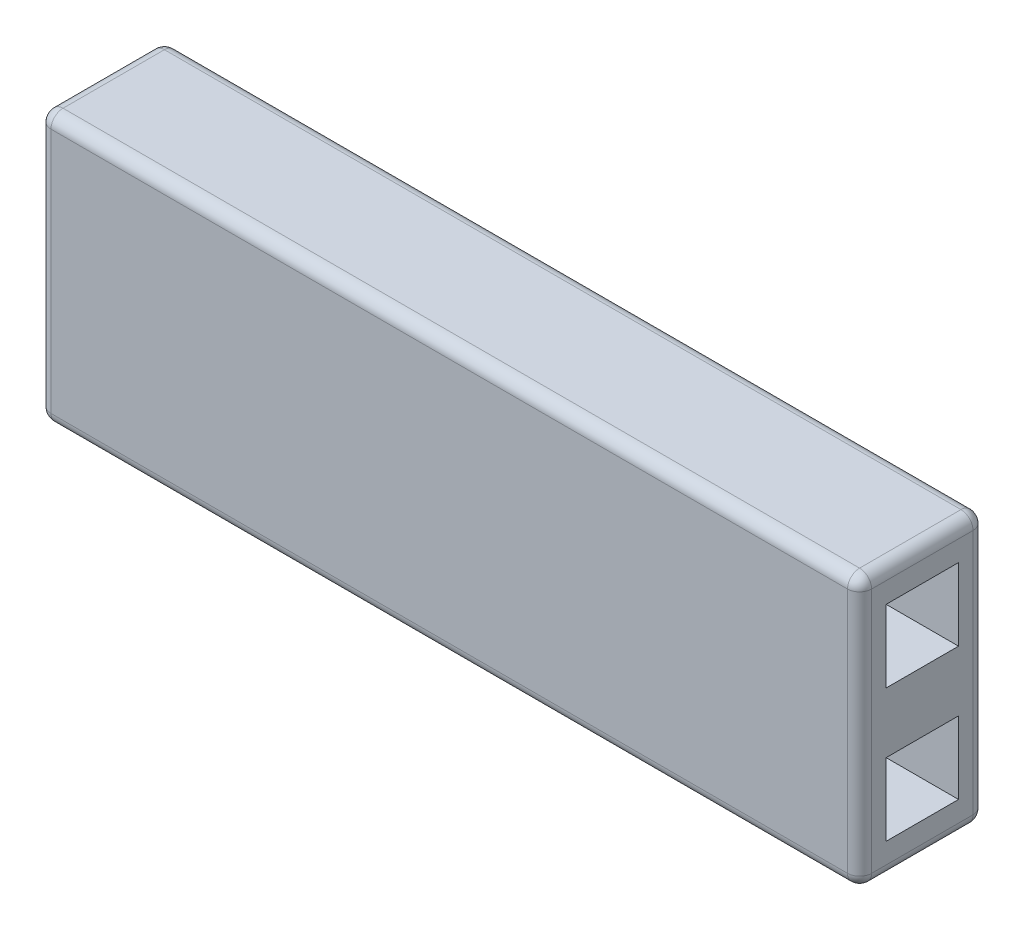
ISO-10303-21;
HEADER;
FILE_DESCRIPTION(('STEP AP214'),'2;1');
FILE_NAME('part.step','',(''),(''),'','','');
FILE_SCHEMA(('AUTOMOTIVE_DESIGN { 1 0 10303 214 1 1 1 1 }'));
ENDSEC;
DATA;
#1=APPLICATION_CONTEXT('core data for automotive mechanical design processes');
#2=APPLICATION_PROTOCOL_DEFINITION('international standard','automotive_design',2000,#1);
#3=PRODUCT_CONTEXT('',#1,'mechanical');
#4=PRODUCT('Part','Part','',(#3));
#5=PRODUCT_RELATED_PRODUCT_CATEGORY('part','',(#4));
#6=PRODUCT_DEFINITION_FORMATION('','',#4);
#7=PRODUCT_DEFINITION_CONTEXT('part definition',#1,'design');
#8=PRODUCT_DEFINITION('design','',#6,#7);
#9=PRODUCT_DEFINITION_SHAPE('','',#8);
#10=(LENGTH_UNIT() NAMED_UNIT(*) SI_UNIT(.MILLI.,.METRE.));
#11=(NAMED_UNIT(*) PLANE_ANGLE_UNIT() SI_UNIT($,.RADIAN.));
#12=(NAMED_UNIT(*) SI_UNIT($,.STERADIAN.) SOLID_ANGLE_UNIT());
#13=UNCERTAINTY_MEASURE_WITH_UNIT(LENGTH_MEASURE(1.E-05),#10,'distance_accuracy_value','');
#14=(GEOMETRIC_REPRESENTATION_CONTEXT(3) GLOBAL_UNCERTAINTY_ASSIGNED_CONTEXT((#13)) GLOBAL_UNIT_ASSIGNED_CONTEXT((#10,
#11,#12)) REPRESENTATION_CONTEXT('',''));
#15=CARTESIAN_POINT('',(0.,0.,0.));
#16=DIRECTION('',(0.,0.,1.));
#17=DIRECTION('',(1.,0.,0.));
#18=AXIS2_PLACEMENT_3D('',#15,#16,#17);
#19=CARTESIAN_POINT('',(17.,2.8,-1.3));
#20=DIRECTION('',(0.,-1.,0.));
#21=DIRECTION('',(0.,0.,-1.));
#22=AXIS2_PLACEMENT_3D('',#19,#20,#21);
#23=PLANE('',#22);
#24=DIRECTION('',(0.,0.,1.));
#25=VECTOR('',#24,1.);
#26=CARTESIAN_POINT('',(0.25,2.8,1.3));
#27=LINE('',#26,#25);
#28=CARTESIAN_POINT('',(0.25,2.8,-1.05));
#29=VERTEX_POINT('',#28);
#30=CARTESIAN_POINT('',(0.25,2.8,1.05));
#31=VERTEX_POINT('',#30);
#32=EDGE_CURVE('E296',#29,#31,#27,.T.);
#33=ORIENTED_EDGE('',*,*,#32,.T.);
#34=DIRECTION('',(-1.,0.,0.));
#35=VECTOR('',#34,1.);
#36=CARTESIAN_POINT('',(17.,2.8,1.05));
#37=LINE('',#36,#35);
#38=CARTESIAN_POINT('',(16.75,2.8,1.05));
#39=VERTEX_POINT('',#38);
#40=EDGE_CURVE('E303',#31,#39,#37,.F.);
#41=ORIENTED_EDGE('',*,*,#40,.T.);
#42=DIRECTION('',(0.,0.,1.));
#43=VECTOR('',#42,1.);
#44=CARTESIAN_POINT('',(16.75,2.8,-1.3));
#45=LINE('',#44,#43);
#46=CARTESIAN_POINT('',(16.75,2.8,-1.05));
#47=VERTEX_POINT('',#46);
#48=EDGE_CURVE('E299',#39,#47,#45,.F.);
#49=ORIENTED_EDGE('',*,*,#48,.T.);
#50=DIRECTION('',(-1.,0.,0.));
#51=VECTOR('',#50,1.);
#52=CARTESIAN_POINT('',(17.,2.8,-1.05));
#53=LINE('',#52,#51);
#54=EDGE_CURVE('E293',#47,#29,#53,.T.);
#55=ORIENTED_EDGE('',*,*,#54,.T.);
#56=EDGE_LOOP('',(#33,#41,#49,#55));
#57=FACE_BOUND('',#56,.T.);
#58=ADVANCED_FACE('F45',(#57),#23,.F.);
#59=CARTESIAN_POINT('',(17.,-2.8,1.3));
#60=DIRECTION('',(0.,0.,-1.));
#61=DIRECTION('',(-1.,0.,0.));
#62=AXIS2_PLACEMENT_3D('',#59,#60,#61);
#63=PLANE('',#62);
#64=DIRECTION('',(0.,-1.,0.));
#65=VECTOR('',#64,1.);
#66=CARTESIAN_POINT('',(16.75,-2.8,1.3));
#67=LINE('',#66,#65);
#68=CARTESIAN_POINT('',(16.75,-2.55,1.3));
#69=VERTEX_POINT('',#68);
#70=CARTESIAN_POINT('',(16.75,2.55,1.3));
#71=VERTEX_POINT('',#70);
#72=EDGE_CURVE('E338',#69,#71,#67,.F.);
#73=ORIENTED_EDGE('',*,*,#72,.T.);
#74=DIRECTION('',(-1.,0.,0.));
#75=VECTOR('',#74,1.);
#76=CARTESIAN_POINT('',(17.,2.55,1.3));
#77=LINE('',#76,#75);
#78=CARTESIAN_POINT('',(0.25,2.55,1.3));
#79=VERTEX_POINT('',#78);
#80=EDGE_CURVE('E341',#71,#79,#77,.T.);
#81=ORIENTED_EDGE('',*,*,#80,.T.);
#82=DIRECTION('',(0.,-1.,0.));
#83=VECTOR('',#82,1.);
#84=CARTESIAN_POINT('',(0.25,-2.8,1.3));
#85=LINE('',#84,#83);
#86=CARTESIAN_POINT('',(0.25,-2.55,1.3));
#87=VERTEX_POINT('',#86);
#88=EDGE_CURVE('E332',#79,#87,#85,.T.);
#89=ORIENTED_EDGE('',*,*,#88,.T.);
#90=DIRECTION('',(-1.,0.,0.));
#91=VECTOR('',#90,1.);
#92=CARTESIAN_POINT('',(17.,-2.55,1.3));
#93=LINE('',#92,#91);
#94=EDGE_CURVE('E335',#87,#69,#93,.F.);
#95=ORIENTED_EDGE('',*,*,#94,.T.);
#96=EDGE_LOOP('',(#73,#81,#89,#95));
#97=FACE_BOUND('',#96,.T.);
#98=ADVANCED_FACE('F525',(#97),#63,.F.);
#99=CARTESIAN_POINT('',(17.,-2.8,-1.3));
#100=DIRECTION('',(0.,1.,0.));
#101=DIRECTION('',(0.,0.,1.));
#102=AXIS2_PLACEMENT_3D('',#99,#100,#101);
#103=PLANE('',#102);
#104=DIRECTION('',(0.,0.,-1.));
#105=VECTOR('',#104,1.);
#106=CARTESIAN_POINT('',(16.75,-2.8,-1.3));
#107=LINE('',#106,#105);
#108=CARTESIAN_POINT('',(16.75,-2.8,-1.05));
#109=VERTEX_POINT('',#108);
#110=CARTESIAN_POINT('',(16.75,-2.8,1.05));
#111=VERTEX_POINT('',#110);
#112=EDGE_CURVE('E325',#109,#111,#107,.F.);
#113=ORIENTED_EDGE('',*,*,#112,.T.);
#114=DIRECTION('',(-1.,0.,0.));
#115=VECTOR('',#114,1.);
#116=CARTESIAN_POINT('',(17.,-2.8,1.05));
#117=LINE('',#116,#115);
#118=CARTESIAN_POINT('',(0.25,-2.8,1.05));
#119=VERTEX_POINT('',#118);
#120=EDGE_CURVE('E329',#111,#119,#117,.T.);
#121=ORIENTED_EDGE('',*,*,#120,.T.);
#122=DIRECTION('',(0.,0.,-1.));
#123=VECTOR('',#122,1.);
#124=CARTESIAN_POINT('',(0.25,-2.8,-1.3));
#125=LINE('',#124,#123);
#126=CARTESIAN_POINT('',(0.25,-2.8,-1.05));
#127=VERTEX_POINT('',#126);
#128=EDGE_CURVE('E322',#119,#127,#125,.T.);
#129=ORIENTED_EDGE('',*,*,#128,.T.);
#130=DIRECTION('',(-1.,0.,0.));
#131=VECTOR('',#130,1.);
#132=CARTESIAN_POINT('',(17.,-2.8,-1.05));
#133=LINE('',#132,#131);
#134=EDGE_CURVE('E319',#127,#109,#133,.F.);
#135=ORIENTED_EDGE('',*,*,#134,.T.);
#136=EDGE_LOOP('',(#113,#121,#129,#135));
#137=FACE_BOUND('',#136,.T.);
#138=ADVANCED_FACE('F483',(#137),#103,.F.);
#139=CARTESIAN_POINT('',(17.,-2.8,-1.3));
#140=DIRECTION('',(0.,0.,1.));
#141=DIRECTION('',(1.,0.,0.));
#142=AXIS2_PLACEMENT_3D('',#139,#140,#141);
#143=PLANE('',#142);
#144=DIRECTION('',(0.,1.,0.));
#145=VECTOR('',#144,1.);
#146=CARTESIAN_POINT('',(16.75,-2.8,-1.3));
#147=LINE('',#146,#145);
#148=CARTESIAN_POINT('',(16.75,2.55,-1.3));
#149=VERTEX_POINT('',#148);
#150=CARTESIAN_POINT('',(16.75,-2.55,-1.3));
#151=VERTEX_POINT('',#150);
#152=EDGE_CURVE('E55',#149,#151,#147,.F.);
#153=ORIENTED_EDGE('',*,*,#152,.T.);
#154=DIRECTION('',(-1.,0.,0.));
#155=VECTOR('',#154,1.);
#156=CARTESIAN_POINT('',(17.,-2.55,-1.3));
#157=LINE('',#156,#155);
#158=CARTESIAN_POINT('',(0.25,-2.55,-1.3));
#159=VERTEX_POINT('',#158);
#160=EDGE_CURVE('E11',#151,#159,#157,.T.);
#161=ORIENTED_EDGE('',*,*,#160,.T.);
#162=DIRECTION('',(0.,1.,0.));
#163=VECTOR('',#162,1.);
#164=CARTESIAN_POINT('',(0.25,2.8,-1.3));
#165=LINE('',#164,#163);
#166=CARTESIAN_POINT('',(0.25,2.55,-1.3));
#167=VERTEX_POINT('',#166);
#168=EDGE_CURVE('E345',#159,#167,#165,.T.);
#169=ORIENTED_EDGE('',*,*,#168,.T.);
#170=DIRECTION('',(-1.,0.,0.));
#171=VECTOR('',#170,1.);
#172=CARTESIAN_POINT('',(17.,2.55,-1.3));
#173=LINE('',#172,#171);
#174=EDGE_CURVE('E66',#167,#149,#173,.F.);
#175=ORIENTED_EDGE('',*,*,#174,.T.);
#176=EDGE_LOOP('',(#153,#161,#169,#175));
#177=FACE_BOUND('',#176,.T.);
#178=ADVANCED_FACE('F457',(#177),#143,.F.);
#179=CARTESIAN_POINT('',(17.,0.,0.));
#180=DIRECTION('',(-1.,0.,0.));
#181=DIRECTION('',(0.,0.,1.));
#182=AXIS2_PLACEMENT_3D('',#179,#180,#181);
#183=PLANE('',#182);
#184=DIRECTION('',(0.,0.,1.));
#185=VECTOR('',#184,1.);
#186=CARTESIAN_POINT('',(17.,2.55,0.));
#187=LINE('',#186,#185);
#188=CARTESIAN_POINT('',(17.,2.55,-1.05));
#189=VERTEX_POINT('',#188);
#190=CARTESIAN_POINT('',(17.,2.55,1.05));
#191=VERTEX_POINT('',#190);
#192=EDGE_CURVE('E286',#189,#191,#187,.T.);
#193=ORIENTED_EDGE('',*,*,#192,.T.);
#194=DIRECTION('',(0.,-1.,0.));
#195=VECTOR('',#194,1.);
#196=CARTESIAN_POINT('',(17.,0.,1.05));
#197=LINE('',#196,#195);
#198=CARTESIAN_POINT('',(17.,-2.55,1.05));
#199=VERTEX_POINT('',#198);
#200=EDGE_CURVE('E290',#191,#199,#197,.T.);
#201=ORIENTED_EDGE('',*,*,#200,.T.);
#202=DIRECTION('',(0.,0.,-1.));
#203=VECTOR('',#202,1.);
#204=CARTESIAN_POINT('',(17.,-2.55,0.));
#205=LINE('',#204,#203);
#206=CARTESIAN_POINT('',(17.,-2.55,-1.05));
#207=VERTEX_POINT('',#206);
#208=EDGE_CURVE('E283',#199,#207,#205,.T.);
#209=ORIENTED_EDGE('',*,*,#208,.T.);
#210=DIRECTION('',(0.,1.,0.));
#211=VECTOR('',#210,1.);
#212=CARTESIAN_POINT('',(17.,0.,-1.05));
#213=LINE('',#212,#211);
#214=EDGE_CURVE('E232',#207,#189,#213,.T.);
#215=ORIENTED_EDGE('',*,*,#214,.T.);
#216=EDGE_LOOP('',(#193,#201,#209,#215));
#217=FACE_BOUND('',#216,.T.);
#218=DIRECTION('',(0.,1.,0.));
#219=VECTOR('',#218,1.);
#220=CARTESIAN_POINT('',(17.,0.625,-0.75));
#221=LINE('',#220,#219);
#222=CARTESIAN_POINT('',(17.,0.625,-0.75));
#223=VERTEX_POINT('',#222);
#224=CARTESIAN_POINT('',(17.,2.125,-0.75));
#225=VERTEX_POINT('',#224);
#226=EDGE_CURVE('E222',#223,#225,#221,.T.);
#227=ORIENTED_EDGE('',*,*,#226,.F.);
#228=DIRECTION('',(0.,0.,-1.));
#229=VECTOR('',#228,1.);
#230=CARTESIAN_POINT('',(17.,0.625,0.75));
#231=LINE('',#230,#229);
#232=CARTESIAN_POINT('',(17.,0.625,0.75));
#233=VERTEX_POINT('',#232);
#234=EDGE_CURVE('E189',#233,#223,#231,.T.);
#235=ORIENTED_EDGE('',*,*,#234,.F.);
#236=DIRECTION('',(0.,-1.,0.));
#237=VECTOR('',#236,1.);
#238=CARTESIAN_POINT('',(17.,0.625,0.75));
#239=LINE('',#238,#237);
#240=CARTESIAN_POINT('',(17.,2.125,0.75));
#241=VERTEX_POINT('',#240);
#242=EDGE_CURVE('E209',#241,#233,#239,.T.);
#243=ORIENTED_EDGE('',*,*,#242,.F.);
#244=DIRECTION('',(0.,0.,1.));
#245=VECTOR('',#244,1.);
#246=CARTESIAN_POINT('',(17.,2.125,0.75));
#247=LINE('',#246,#245);
#248=EDGE_CURVE('E213',#225,#241,#247,.T.);
#249=ORIENTED_EDGE('',*,*,#248,.F.);
#250=EDGE_LOOP('',(#227,#235,#243,#249));
#251=FACE_BOUND('',#250,.T.);
#252=DIRECTION('',(0.,-1.,0.));
#253=VECTOR('',#252,1.);
#254=CARTESIAN_POINT('',(17.,-0.625,0.75));
#255=LINE('',#254,#253);
#256=CARTESIAN_POINT('',(17.,-0.625,0.75));
#257=VERTEX_POINT('',#256);
#258=CARTESIAN_POINT('',(17.,-2.125,0.75));
#259=VERTEX_POINT('',#258);
#260=EDGE_CURVE('E261',#257,#259,#255,.T.);
#261=ORIENTED_EDGE('',*,*,#260,.F.);
#262=DIRECTION('',(0.,0.,1.));
#263=VECTOR('',#262,1.);
#264=CARTESIAN_POINT('',(17.,-0.625,0.75));
#265=LINE('',#264,#263);
#266=CARTESIAN_POINT('',(17.,-0.625,-0.75));
#267=VERTEX_POINT('',#266);
#268=EDGE_CURVE('E223',#267,#257,#265,.T.);
#269=ORIENTED_EDGE('',*,*,#268,.F.);
#270=DIRECTION('',(0.,1.,0.));
#271=VECTOR('',#270,1.);
#272=CARTESIAN_POINT('',(17.,-0.625,-0.75));
#273=LINE('',#272,#271);
#274=CARTESIAN_POINT('',(17.,-2.125,-0.75));
#275=VERTEX_POINT('',#274);
#276=EDGE_CURVE('E252',#275,#267,#273,.T.);
#277=ORIENTED_EDGE('',*,*,#276,.F.);
#278=DIRECTION('',(0.,0.,-1.));
#279=VECTOR('',#278,1.);
#280=CARTESIAN_POINT('',(17.,-2.125,0.75));
#281=LINE('',#280,#279);
#282=EDGE_CURVE('E256',#259,#275,#281,.T.);
#283=ORIENTED_EDGE('',*,*,#282,.F.);
#284=EDGE_LOOP('',(#261,#269,#277,#283));
#285=FACE_BOUND('',#284,.T.);
#286=ADVANCED_FACE('F472',(#217,#251,#285),#183,.F.);
#287=CARTESIAN_POINT('',(0.,0.,0.));
#288=DIRECTION('',(-1.,0.,0.));
#289=DIRECTION('',(0.,0.,1.));
#290=AXIS2_PLACEMENT_3D('',#287,#288,#289);
#291=PLANE('',#290);
#292=DIRECTION('',(0.,0.,-1.));
#293=VECTOR('',#292,1.);
#294=CARTESIAN_POINT('',(0.,-2.55,1.3));
#295=LINE('',#294,#293);
#296=CARTESIAN_POINT('',(0.,-2.55,-1.05));
#297=VERTEX_POINT('',#296);
#298=CARTESIAN_POINT('',(0.,-2.55,1.05));
#299=VERTEX_POINT('',#298);
#300=EDGE_CURVE('E309',#297,#299,#295,.F.);
#301=ORIENTED_EDGE('',*,*,#300,.T.);
#302=DIRECTION('',(0.,-1.,0.));
#303=VECTOR('',#302,1.);
#304=CARTESIAN_POINT('',(0.,2.8,1.05));
#305=LINE('',#304,#303);
#306=CARTESIAN_POINT('',(0.,2.55,1.05));
#307=VERTEX_POINT('',#306);
#308=EDGE_CURVE('E316',#299,#307,#305,.F.);
#309=ORIENTED_EDGE('',*,*,#308,.T.);
#310=DIRECTION('',(0.,0.,1.));
#311=VECTOR('',#310,1.);
#312=CARTESIAN_POINT('',(0.,2.55,-1.3));
#313=LINE('',#312,#311);
#314=CARTESIAN_POINT('',(0.,2.55,-1.05));
#315=VERTEX_POINT('',#314);
#316=EDGE_CURVE('E312',#307,#315,#313,.F.);
#317=ORIENTED_EDGE('',*,*,#316,.T.);
#318=DIRECTION('',(0.,1.,0.));
#319=VECTOR('',#318,1.);
#320=CARTESIAN_POINT('',(0.,-2.8,-1.05));
#321=LINE('',#320,#319);
#322=EDGE_CURVE('E306',#315,#297,#321,.F.);
#323=ORIENTED_EDGE('',*,*,#322,.T.);
#324=EDGE_LOOP('',(#301,#309,#317,#323));
#325=FACE_BOUND('',#324,.T.);
#326=ADVANCED_FACE('F493',(#325),#291,.T.);
#327=CARTESIAN_POINT('',(14.,-0.625,0.75));
#328=DIRECTION('',(0.,1.,0.));
#329=DIRECTION('',(0.,0.,1.));
#330=AXIS2_PLACEMENT_3D('',#327,#328,#329);
#331=PLANE('',#330);
#332=ORIENTED_EDGE('',*,*,#268,.T.);
#333=DIRECTION('',(1.,0.,0.));
#334=VECTOR('',#333,1.);
#335=CARTESIAN_POINT('',(14.,-0.625,0.75));
#336=LINE('',#335,#334);
#337=CARTESIAN_POINT('',(14.,-0.625,0.75));
#338=VERTEX_POINT('',#337);
#339=EDGE_CURVE('E238',#338,#257,#336,.T.);
#340=ORIENTED_EDGE('',*,*,#339,.F.);
#341=DIRECTION('',(0.,0.,1.));
#342=VECTOR('',#341,1.);
#343=CARTESIAN_POINT('',(14.,-0.625,0.75));
#344=LINE('',#343,#342);
#345=CARTESIAN_POINT('',(14.,-0.625,-0.75));
#346=VERTEX_POINT('',#345);
#347=EDGE_CURVE('E257',#346,#338,#344,.T.);
#348=ORIENTED_EDGE('',*,*,#347,.F.);
#349=DIRECTION('',(1.,0.,0.));
#350=VECTOR('',#349,1.);
#351=CARTESIAN_POINT('',(14.,-0.625,-0.75));
#352=LINE('',#351,#350);
#353=EDGE_CURVE('E249',#346,#267,#352,.T.);
#354=ORIENTED_EDGE('',*,*,#353,.T.);
#355=EDGE_LOOP('',(#332,#340,#348,#354));
#356=FACE_BOUND('',#355,.T.);
#357=ADVANCED_FACE('F758',(#356),#331,.F.);
#358=CARTESIAN_POINT('',(14.,-0.625,-0.75));
#359=DIRECTION('',(0.,0.,-1.));
#360=DIRECTION('',(0.,1.,0.));
#361=AXIS2_PLACEMENT_3D('',#358,#359,#360);
#362=PLANE('',#361);
#363=ORIENTED_EDGE('',*,*,#276,.T.);
#364=ORIENTED_EDGE('',*,*,#353,.F.);
#365=DIRECTION('',(0.,1.,0.));
#366=VECTOR('',#365,1.);
#367=CARTESIAN_POINT('',(14.,-0.625,-0.75));
#368=LINE('',#367,#366);
#369=CARTESIAN_POINT('',(14.,-2.125,-0.75));
#370=VERTEX_POINT('',#369);
#371=EDGE_CURVE('E242',#370,#346,#368,.T.);
#372=ORIENTED_EDGE('',*,*,#371,.F.);
#373=DIRECTION('',(1.,0.,0.));
#374=VECTOR('',#373,1.);
#375=CARTESIAN_POINT('',(14.,-2.125,-0.75));
#376=LINE('',#375,#374);
#377=EDGE_CURVE('E246',#370,#275,#376,.T.);
#378=ORIENTED_EDGE('',*,*,#377,.T.);
#379=EDGE_LOOP('',(#363,#364,#372,#378));
#380=FACE_BOUND('',#379,.T.);
#381=ADVANCED_FACE('F749',(#380),#362,.F.);
#382=CARTESIAN_POINT('',(14.,-2.125,0.75));
#383=DIRECTION('',(0.,-1.,0.));
#384=DIRECTION('',(0.,0.,-1.));
#385=AXIS2_PLACEMENT_3D('',#382,#383,#384);
#386=PLANE('',#385);
#387=ORIENTED_EDGE('',*,*,#282,.T.);
#388=ORIENTED_EDGE('',*,*,#377,.F.);
#389=DIRECTION('',(0.,0.,-1.));
#390=VECTOR('',#389,1.);
#391=CARTESIAN_POINT('',(14.,-2.125,0.75));
#392=LINE('',#391,#390);
#393=CARTESIAN_POINT('',(14.,-2.125,0.75));
#394=VERTEX_POINT('',#393);
#395=EDGE_CURVE('E270',#394,#370,#392,.T.);
#396=ORIENTED_EDGE('',*,*,#395,.F.);
#397=DIRECTION('',(1.,0.,0.));
#398=VECTOR('',#397,1.);
#399=CARTESIAN_POINT('',(14.,-2.125,0.75));
#400=LINE('',#399,#398);
#401=EDGE_CURVE('E243',#394,#259,#400,.T.);
#402=ORIENTED_EDGE('',*,*,#401,.T.);
#403=EDGE_LOOP('',(#387,#388,#396,#402));
#404=FACE_BOUND('',#403,.T.);
#405=ADVANCED_FACE('F740',(#404),#386,.F.);
#406=CARTESIAN_POINT('',(14.,-0.625,0.75));
#407=DIRECTION('',(0.,0.,1.));
#408=DIRECTION('',(0.,-1.,0.));
#409=AXIS2_PLACEMENT_3D('',#406,#407,#408);
#410=PLANE('',#409);
#411=ORIENTED_EDGE('',*,*,#260,.T.);
#412=ORIENTED_EDGE('',*,*,#401,.F.);
#413=DIRECTION('',(0.,-1.,0.));
#414=VECTOR('',#413,1.);
#415=CARTESIAN_POINT('',(14.,-0.625,0.75));
#416=LINE('',#415,#414);
#417=EDGE_CURVE('E274',#338,#394,#416,.T.);
#418=ORIENTED_EDGE('',*,*,#417,.F.);
#419=ORIENTED_EDGE('',*,*,#339,.T.);
#420=EDGE_LOOP('',(#411,#412,#418,#419));
#421=FACE_BOUND('',#420,.T.);
#422=ADVANCED_FACE('F731',(#421),#410,.F.);
#423=CARTESIAN_POINT('',(14.,0.,0.));
#424=DIRECTION('',(-1.,0.,0.));
#425=DIRECTION('',(0.,0.,1.));
#426=AXIS2_PLACEMENT_3D('',#423,#424,#425);
#427=PLANE('',#426);
#428=ORIENTED_EDGE('',*,*,#347,.T.);
#429=ORIENTED_EDGE('',*,*,#417,.T.);
#430=ORIENTED_EDGE('',*,*,#395,.T.);
#431=ORIENTED_EDGE('',*,*,#371,.T.);
#432=EDGE_LOOP('',(#428,#429,#430,#431));
#433=FACE_BOUND('',#432,.T.);
#434=ADVANCED_FACE('F723',(#433),#427,.F.);
#435=CARTESIAN_POINT('',(14.,0.625,0.75));
#436=DIRECTION('',(0.,-1.,0.));
#437=DIRECTION('',(0.,0.,-1.));
#438=AXIS2_PLACEMENT_3D('',#435,#436,#437);
#439=PLANE('',#438);
#440=ORIENTED_EDGE('',*,*,#234,.T.);
#441=DIRECTION('',(1.,0.,0.));
#442=VECTOR('',#441,1.);
#443=CARTESIAN_POINT('',(14.,0.625,-0.75));
#444=LINE('',#443,#442);
#445=CARTESIAN_POINT('',(14.,0.625,-0.75));
#446=VERTEX_POINT('',#445);
#447=EDGE_CURVE('E182',#446,#223,#444,.T.);
#448=ORIENTED_EDGE('',*,*,#447,.F.);
#449=DIRECTION('',(0.,0.,-1.));
#450=VECTOR('',#449,1.);
#451=CARTESIAN_POINT('',(14.,0.625,0.75));
#452=LINE('',#451,#450);
#453=CARTESIAN_POINT('',(14.,0.625,0.75));
#454=VERTEX_POINT('',#453);
#455=EDGE_CURVE('E186',#454,#446,#452,.T.);
#456=ORIENTED_EDGE('',*,*,#455,.F.);
#457=DIRECTION('',(1.,0.,0.));
#458=VECTOR('',#457,1.);
#459=CARTESIAN_POINT('',(14.,0.625,0.75));
#460=LINE('',#459,#458);
#461=EDGE_CURVE('E229',#454,#233,#460,.T.);
#462=ORIENTED_EDGE('',*,*,#461,.T.);
#463=EDGE_LOOP('',(#440,#448,#456,#462));
#464=FACE_BOUND('',#463,.T.);
#465=ADVANCED_FACE('F184',(#464),#439,.F.);
#466=CARTESIAN_POINT('',(14.,0.625,0.75));
#467=DIRECTION('',(0.,0.,1.));
#468=DIRECTION('',(0.,-1.,0.));
#469=AXIS2_PLACEMENT_3D('',#466,#467,#468);
#470=PLANE('',#469);
#471=ORIENTED_EDGE('',*,*,#242,.T.);
#472=ORIENTED_EDGE('',*,*,#461,.F.);
#473=DIRECTION('',(0.,-1.,0.));
#474=VECTOR('',#473,1.);
#475=CARTESIAN_POINT('',(14.,0.625,0.75));
#476=LINE('',#475,#474);
#477=CARTESIAN_POINT('',(14.,2.125,0.75));
#478=VERTEX_POINT('',#477);
#479=EDGE_CURVE('E195',#478,#454,#476,.T.);
#480=ORIENTED_EDGE('',*,*,#479,.F.);
#481=DIRECTION('',(1.,0.,0.));
#482=VECTOR('',#481,1.);
#483=CARTESIAN_POINT('',(14.,2.125,0.75));
#484=LINE('',#483,#482);
#485=EDGE_CURVE('E233',#478,#241,#484,.T.);
#486=ORIENTED_EDGE('',*,*,#485,.T.);
#487=EDGE_LOOP('',(#471,#472,#480,#486));
#488=FACE_BOUND('',#487,.T.);
#489=ADVANCED_FACE('F706',(#488),#470,.F.);
#490=CARTESIAN_POINT('',(14.,2.125,0.75));
#491=DIRECTION('',(0.,1.,0.));
#492=DIRECTION('',(0.,0.,1.));
#493=AXIS2_PLACEMENT_3D('',#490,#491,#492);
#494=PLANE('',#493);
#495=ORIENTED_EDGE('',*,*,#248,.T.);
#496=ORIENTED_EDGE('',*,*,#485,.F.);
#497=DIRECTION('',(0.,0.,1.));
#498=VECTOR('',#497,1.);
#499=CARTESIAN_POINT('',(14.,2.125,0.75));
#500=LINE('',#499,#498);
#501=CARTESIAN_POINT('',(14.,2.125,-0.75));
#502=VERTEX_POINT('',#501);
#503=EDGE_CURVE('E204',#502,#478,#500,.T.);
#504=ORIENTED_EDGE('',*,*,#503,.F.);
#505=DIRECTION('',(1.,0.,0.));
#506=VECTOR('',#505,1.);
#507=CARTESIAN_POINT('',(14.,2.125,-0.75));
#508=LINE('',#507,#506);
#509=EDGE_CURVE('E194',#502,#225,#508,.T.);
#510=ORIENTED_EDGE('',*,*,#509,.T.);
#511=EDGE_LOOP('',(#495,#496,#504,#510));
#512=FACE_BOUND('',#511,.T.);
#513=ADVANCED_FACE('F698',(#512),#494,.F.);
#514=CARTESIAN_POINT('',(14.,0.625,-0.75));
#515=DIRECTION('',(0.,0.,-1.));
#516=DIRECTION('',(0.,1.,0.));
#517=AXIS2_PLACEMENT_3D('',#514,#515,#516);
#518=PLANE('',#517);
#519=ORIENTED_EDGE('',*,*,#226,.T.);
#520=ORIENTED_EDGE('',*,*,#509,.F.);
#521=DIRECTION('',(0.,1.,0.));
#522=VECTOR('',#521,1.);
#523=CARTESIAN_POINT('',(14.,0.625,-0.75));
#524=LINE('',#523,#522);
#525=EDGE_CURVE('E198',#446,#502,#524,.T.);
#526=ORIENTED_EDGE('',*,*,#525,.F.);
#527=ORIENTED_EDGE('',*,*,#447,.T.);
#528=EDGE_LOOP('',(#519,#520,#526,#527));
#529=FACE_BOUND('',#528,.T.);
#530=ADVANCED_FACE('F199',(#529),#518,.F.);
#531=CARTESIAN_POINT('',(14.,0.,0.));
#532=DIRECTION('',(1.,0.,0.));
#533=DIRECTION('',(0.,0.,-1.));
#534=AXIS2_PLACEMENT_3D('',#531,#532,#533);
#535=PLANE('',#534);
#536=ORIENTED_EDGE('',*,*,#455,.T.);
#537=ORIENTED_EDGE('',*,*,#525,.T.);
#538=ORIENTED_EDGE('',*,*,#503,.T.);
#539=ORIENTED_EDGE('',*,*,#479,.T.);
#540=EDGE_LOOP('',(#536,#537,#538,#539));
#541=FACE_BOUND('',#540,.T.);
#542=ADVANCED_FACE('F206',(#541),#535,.T.);
#543=CARTESIAN_POINT('',(0.25,-2.55,-1.3));
#544=DIRECTION('',(0.,0.,1.));
#545=DIRECTION('',(1.,0.,0.));
#546=AXIS2_PLACEMENT_3D('',#543,#544,#545);
#547=CYLINDRICAL_SURFACE('',#546,0.25);
#548=CARTESIAN_POINT('',(0.25,-2.55,-1.05));
#549=DIRECTION('',(0.,0.,-1.));
#550=DIRECTION('',(-1.,0.,0.));
#551=AXIS2_PLACEMENT_3D('',#548,#549,#550);
#552=CIRCLE('',#551,0.25);
#553=EDGE_CURVE('E49',#127,#297,#552,.T.);
#554=ORIENTED_EDGE('',*,*,#553,.F.);
#555=ORIENTED_EDGE('',*,*,#128,.F.);
#556=CARTESIAN_POINT('',(0.25,-2.55,1.05));
#557=DIRECTION('',(0.,0.,1.));
#558=DIRECTION('',(0.,-1.,0.));
#559=AXIS2_PLACEMENT_3D('',#556,#557,#558);
#560=CIRCLE('',#559,0.25);
#561=EDGE_CURVE('E434',#299,#119,#560,.T.);
#562=ORIENTED_EDGE('',*,*,#561,.F.);
#563=ORIENTED_EDGE('',*,*,#300,.F.);
#564=EDGE_LOOP('',(#554,#555,#562,#563));
#565=FACE_BOUND('',#564,.T.);
#566=ADVANCED_FACE('F47',(#565),#547,.T.);
#567=CARTESIAN_POINT('',(0.25,-2.55,-1.05));
#568=DIRECTION('',(-1.,0.,0.));
#569=DIRECTION('',(0.,0.,1.));
#570=AXIS2_PLACEMENT_3D('',#567,#568,#569);
#571=SPHERICAL_SURFACE('',#570,0.25);
#572=CARTESIAN_POINT('',(0.25,-2.55,-1.05));
#573=DIRECTION('',(-1.,0.,0.));
#574=DIRECTION('',(0.,0.,1.));
#575=AXIS2_PLACEMENT_3D('',#572,#573,#574);
#576=CIRCLE('',#575,0.25);
#577=EDGE_CURVE('E427',#127,#159,#576,.F.);
#578=ORIENTED_EDGE('',*,*,#577,.F.);
#579=ORIENTED_EDGE('',*,*,#553,.T.);
#580=CARTESIAN_POINT('',(0.25,-2.55,-1.05));
#581=DIRECTION('',(0.,-1.,0.));
#582=DIRECTION('',(0.,0.,-1.));
#583=AXIS2_PLACEMENT_3D('',#580,#581,#582);
#584=CIRCLE('',#583,0.25);
#585=EDGE_CURVE('E431',#159,#297,#584,.F.);
#586=ORIENTED_EDGE('',*,*,#585,.F.);
#587=EDGE_LOOP('',(#578,#579,#586));
#588=FACE_BOUND('',#587,.T.);
#589=ADVANCED_FACE('F447',(#588),#571,.T.);
#590=CARTESIAN_POINT('',(0.25,-2.55,1.05));
#591=DIRECTION('',(0.,-1.,0.));
#592=DIRECTION('',(0.,0.,-1.));
#593=AXIS2_PLACEMENT_3D('',#590,#591,#592);
#594=SPHERICAL_SURFACE('',#593,0.25);
#595=CARTESIAN_POINT('',(0.25,-2.55,1.05));
#596=DIRECTION('',(0.,-1.,0.));
#597=DIRECTION('',(0.,0.,-1.));
#598=AXIS2_PLACEMENT_3D('',#595,#596,#597);
#599=CIRCLE('',#598,0.25);
#600=EDGE_CURVE('E419',#299,#87,#599,.F.);
#601=ORIENTED_EDGE('',*,*,#600,.F.);
#602=ORIENTED_EDGE('',*,*,#561,.T.);
#603=CARTESIAN_POINT('',(0.25,-2.55,1.05));
#604=DIRECTION('',(-1.,0.,0.));
#605=DIRECTION('',(0.,0.,1.));
#606=AXIS2_PLACEMENT_3D('',#603,#604,#605);
#607=CIRCLE('',#606,0.25);
#608=EDGE_CURVE('E423',#87,#119,#607,.F.);
#609=ORIENTED_EDGE('',*,*,#608,.F.);
#610=EDGE_LOOP('',(#601,#602,#609));
#611=FACE_BOUND('',#610,.T.);
#612=ADVANCED_FACE('F485',(#611),#594,.T.);
#613=CARTESIAN_POINT('',(0.25,-2.8,-1.05));
#614=DIRECTION('',(0.,-1.,0.));
#615=DIRECTION('',(0.,0.,-1.));
#616=AXIS2_PLACEMENT_3D('',#613,#614,#615);
#617=CYLINDRICAL_SURFACE('',#616,0.25);
#618=ORIENTED_EDGE('',*,*,#585,.T.);
#619=ORIENTED_EDGE('',*,*,#322,.F.);
#620=CARTESIAN_POINT('',(0.25,2.55,-1.05));
#621=DIRECTION('',(0.,1.,0.));
#622=DIRECTION('',(0.,0.,1.));
#623=AXIS2_PLACEMENT_3D('',#620,#621,#622);
#624=CIRCLE('',#623,0.25);
#625=EDGE_CURVE('E412',#167,#315,#624,.T.);
#626=ORIENTED_EDGE('',*,*,#625,.F.);
#627=ORIENTED_EDGE('',*,*,#168,.F.);
#628=EDGE_LOOP('',(#618,#619,#626,#627));
#629=FACE_BOUND('',#628,.T.);
#630=ADVANCED_FACE('F454',(#629),#617,.T.);
#631=CARTESIAN_POINT('',(17.,-2.55,-1.05));
#632=DIRECTION('',(-1.,0.,0.));
#633=DIRECTION('',(0.,0.,1.));
#634=AXIS2_PLACEMENT_3D('',#631,#632,#633);
#635=CYLINDRICAL_SURFACE('',#634,0.25);
#636=ORIENTED_EDGE('',*,*,#577,.T.);
#637=ORIENTED_EDGE('',*,*,#160,.F.);
#638=CARTESIAN_POINT('',(16.75,-2.55,-1.05));
#639=DIRECTION('',(1.,0.,0.));
#640=DIRECTION('',(0.,0.,-1.));
#641=AXIS2_PLACEMENT_3D('',#638,#639,#640);
#642=CIRCLE('',#641,0.25);
#643=EDGE_CURVE('E408',#109,#151,#642,.T.);
#644=ORIENTED_EDGE('',*,*,#643,.F.);
#645=ORIENTED_EDGE('',*,*,#134,.F.);
#646=EDGE_LOOP('',(#636,#637,#644,#645));
#647=FACE_BOUND('',#646,.T.);
#648=ADVANCED_FACE('F460',(#647),#635,.T.);
#649=CARTESIAN_POINT('',(16.75,-2.55,0.));
#650=DIRECTION('',(0.,0.,-1.));
#651=DIRECTION('',(-1.,0.,0.));
#652=AXIS2_PLACEMENT_3D('',#649,#650,#651);
#653=CYLINDRICAL_SURFACE('',#652,0.25);
#654=CARTESIAN_POINT('',(16.75,-2.55,1.05));
#655=DIRECTION('',(0.,0.,1.));
#656=DIRECTION('',(1.,0.,0.));
#657=AXIS2_PLACEMENT_3D('',#654,#655,#656);
#658=CIRCLE('',#657,0.25);
#659=EDGE_CURVE('E400',#111,#199,#658,.T.);
#660=ORIENTED_EDGE('',*,*,#659,.F.);
#661=ORIENTED_EDGE('',*,*,#112,.F.);
#662=CARTESIAN_POINT('',(16.75,-2.55,-1.05));
#663=DIRECTION('',(0.,0.,-1.));
#664=DIRECTION('',(-1.,0.,0.));
#665=AXIS2_PLACEMENT_3D('',#662,#663,#664);
#666=CIRCLE('',#665,0.25);
#667=EDGE_CURVE('E404',#207,#109,#666,.T.);
#668=ORIENTED_EDGE('',*,*,#667,.F.);
#669=ORIENTED_EDGE('',*,*,#208,.F.);
#670=EDGE_LOOP('',(#660,#661,#668,#669));
#671=FACE_BOUND('',#670,.T.);
#672=ADVANCED_FACE('F480',(#671),#653,.T.);
#673=CARTESIAN_POINT('',(17.,-2.55,1.05));
#674=DIRECTION('',(-1.,0.,0.));
#675=DIRECTION('',(0.,0.,1.));
#676=AXIS2_PLACEMENT_3D('',#673,#674,#675);
#677=CYLINDRICAL_SURFACE('',#676,0.25);
#678=ORIENTED_EDGE('',*,*,#608,.T.);
#679=ORIENTED_EDGE('',*,*,#120,.F.);
#680=CARTESIAN_POINT('',(16.75,-2.55,1.05));
#681=DIRECTION('',(1.,0.,0.));
#682=DIRECTION('',(0.,0.,-1.));
#683=AXIS2_PLACEMENT_3D('',#680,#681,#682);
#684=CIRCLE('',#683,0.25);
#685=EDGE_CURVE('E397',#69,#111,#684,.T.);
#686=ORIENTED_EDGE('',*,*,#685,.F.);
#687=ORIENTED_EDGE('',*,*,#94,.F.);
#688=EDGE_LOOP('',(#678,#679,#686,#687));
#689=FACE_BOUND('',#688,.T.);
#690=ADVANCED_FACE('F523',(#689),#677,.T.);
#691=CARTESIAN_POINT('',(0.25,-2.8,1.05));
#692=DIRECTION('',(0.,1.,0.));
#693=DIRECTION('',(0.,0.,1.));
#694=AXIS2_PLACEMENT_3D('',#691,#692,#693);
#695=CYLINDRICAL_SURFACE('',#694,0.25);
#696=ORIENTED_EDGE('',*,*,#600,.T.);
#697=ORIENTED_EDGE('',*,*,#88,.F.);
#698=CARTESIAN_POINT('',(0.25,2.55,1.05));
#699=DIRECTION('',(0.,1.,0.));
#700=DIRECTION('',(0.,0.,1.));
#701=AXIS2_PLACEMENT_3D('',#698,#699,#700);
#702=CIRCLE('',#701,0.25);
#703=EDGE_CURVE('E393',#307,#79,#702,.T.);
#704=ORIENTED_EDGE('',*,*,#703,.F.);
#705=ORIENTED_EDGE('',*,*,#308,.F.);
#706=EDGE_LOOP('',(#696,#697,#704,#705));
#707=FACE_BOUND('',#706,.T.);
#708=ADVANCED_FACE('F490',(#707),#695,.T.);
#709=CARTESIAN_POINT('',(0.25,2.55,-1.3));
#710=DIRECTION('',(0.,0.,-1.));
#711=DIRECTION('',(-1.,0.,0.));
#712=AXIS2_PLACEMENT_3D('',#709,#710,#711);
#713=CYLINDRICAL_SURFACE('',#712,0.25);
#714=CARTESIAN_POINT('',(0.25,2.55,-1.05));
#715=DIRECTION('',(0.,0.,-1.));
#716=DIRECTION('',(-1.,0.,0.));
#717=AXIS2_PLACEMENT_3D('',#714,#715,#716);
#718=CIRCLE('',#717,0.25);
#719=EDGE_CURVE('E415',#315,#29,#718,.T.);
#720=ORIENTED_EDGE('',*,*,#719,.F.);
#721=ORIENTED_EDGE('',*,*,#316,.F.);
#722=CARTESIAN_POINT('',(0.25,2.55,1.05));
#723=DIRECTION('',(0.,0.,1.));
#724=DIRECTION('',(1.,0.,0.));
#725=AXIS2_PLACEMENT_3D('',#722,#723,#724);
#726=CIRCLE('',#725,0.25);
#727=EDGE_CURVE('E389',#31,#307,#726,.T.);
#728=ORIENTED_EDGE('',*,*,#727,.F.);
#729=ORIENTED_EDGE('',*,*,#32,.F.);
#730=EDGE_LOOP('',(#720,#721,#728,#729));
#731=FACE_BOUND('',#730,.T.);
#732=ADVANCED_FACE('F497',(#731),#713,.T.);
#733=CARTESIAN_POINT('',(0.25,2.55,-1.05));
#734=DIRECTION('',(-1.,0.,0.));
#735=DIRECTION('',(0.,0.,1.));
#736=AXIS2_PLACEMENT_3D('',#733,#734,#735);
#737=SPHERICAL_SURFACE('',#736,0.25);
#738=ORIENTED_EDGE('',*,*,#625,.T.);
#739=ORIENTED_EDGE('',*,*,#719,.T.);
#740=CARTESIAN_POINT('',(0.25,2.55,-1.05));
#741=DIRECTION('',(-1.,0.,0.));
#742=DIRECTION('',(0.,0.,1.));
#743=AXIS2_PLACEMENT_3D('',#740,#741,#742);
#744=CIRCLE('',#743,0.25);
#745=EDGE_CURVE('E385',#167,#29,#744,.F.);
#746=ORIENTED_EDGE('',*,*,#745,.F.);
#747=EDGE_LOOP('',(#738,#739,#746));
#748=FACE_BOUND('',#747,.T.);
#749=ADVANCED_FACE('F501',(#748),#737,.T.);
#750=CARTESIAN_POINT('',(16.75,-2.55,-1.05));
#751=DIRECTION('',(0.,-1.,0.));
#752=DIRECTION('',(0.,0.,-1.));
#753=AXIS2_PLACEMENT_3D('',#750,#751,#752);
#754=SPHERICAL_SURFACE('',#753,0.25);
#755=ORIENTED_EDGE('',*,*,#667,.T.);
#756=ORIENTED_EDGE('',*,*,#643,.T.);
#757=CARTESIAN_POINT('',(16.75,-2.55,-1.05));
#758=DIRECTION('',(0.,-1.,0.));
#759=DIRECTION('',(0.,0.,-1.));
#760=AXIS2_PLACEMENT_3D('',#757,#758,#759);
#761=CIRCLE('',#760,0.25);
#762=EDGE_CURVE('E381',#207,#151,#761,.F.);
#763=ORIENTED_EDGE('',*,*,#762,.F.);
#764=EDGE_LOOP('',(#755,#756,#763));
#765=FACE_BOUND('',#764,.T.);
#766=ADVANCED_FACE('F463',(#765),#754,.T.);
#767=CARTESIAN_POINT('',(16.75,-2.55,1.05));
#768=DIRECTION('',(0.,-1.,0.));
#769=DIRECTION('',(0.,0.,-1.));
#770=AXIS2_PLACEMENT_3D('',#767,#768,#769);
#771=SPHERICAL_SURFACE('',#770,0.25);
#772=ORIENTED_EDGE('',*,*,#685,.T.);
#773=ORIENTED_EDGE('',*,*,#659,.T.);
#774=CARTESIAN_POINT('',(16.75,-2.55,1.05));
#775=DIRECTION('',(0.,-1.,0.));
#776=DIRECTION('',(0.,0.,-1.));
#777=AXIS2_PLACEMENT_3D('',#774,#775,#776);
#778=CIRCLE('',#777,0.25);
#779=EDGE_CURVE('E377',#69,#199,#778,.F.);
#780=ORIENTED_EDGE('',*,*,#779,.F.);
#781=EDGE_LOOP('',(#772,#773,#780));
#782=FACE_BOUND('',#781,.T.);
#783=ADVANCED_FACE('F520',(#782),#771,.T.);
#784=CARTESIAN_POINT('',(0.25,2.55,1.05));
#785=DIRECTION('',(-1.,0.,0.));
#786=DIRECTION('',(0.,0.,1.));
#787=AXIS2_PLACEMENT_3D('',#784,#785,#786);
#788=SPHERICAL_SURFACE('',#787,0.25);
#789=ORIENTED_EDGE('',*,*,#727,.T.);
#790=ORIENTED_EDGE('',*,*,#703,.T.);
#791=CARTESIAN_POINT('',(0.25,2.55,1.05));
#792=DIRECTION('',(-1.,0.,0.));
#793=DIRECTION('',(0.,0.,1.));
#794=AXIS2_PLACEMENT_3D('',#791,#792,#793);
#795=CIRCLE('',#794,0.25);
#796=EDGE_CURVE('E374',#31,#79,#795,.F.);
#797=ORIENTED_EDGE('',*,*,#796,.F.);
#798=EDGE_LOOP('',(#789,#790,#797));
#799=FACE_BOUND('',#798,.T.);
#800=ADVANCED_FACE('F531',(#799),#788,.T.);
#801=CARTESIAN_POINT('',(17.,2.55,-1.05));
#802=DIRECTION('',(-1.,0.,0.));
#803=DIRECTION('',(0.,0.,1.));
#804=AXIS2_PLACEMENT_3D('',#801,#802,#803);
#805=CYLINDRICAL_SURFACE('',#804,0.25);
#806=ORIENTED_EDGE('',*,*,#745,.T.);
#807=ORIENTED_EDGE('',*,*,#54,.F.);
#808=CARTESIAN_POINT('',(16.75,2.55,-1.05));
#809=DIRECTION('',(1.,0.,0.));
#810=DIRECTION('',(0.,0.,-1.));
#811=AXIS2_PLACEMENT_3D('',#808,#809,#810);
#812=CIRCLE('',#811,0.25);
#813=EDGE_CURVE('E370',#149,#47,#812,.T.);
#814=ORIENTED_EDGE('',*,*,#813,.F.);
#815=ORIENTED_EDGE('',*,*,#174,.F.);
#816=EDGE_LOOP('',(#806,#807,#814,#815));
#817=FACE_BOUND('',#816,.T.);
#818=ADVANCED_FACE('F504',(#817),#805,.T.);
#819=CARTESIAN_POINT('',(16.75,0.,-1.05));
#820=DIRECTION('',(0.,1.,0.));
#821=DIRECTION('',(0.,0.,1.));
#822=AXIS2_PLACEMENT_3D('',#819,#820,#821);
#823=CYLINDRICAL_SURFACE('',#822,0.25);
#824=ORIENTED_EDGE('',*,*,#762,.T.);
#825=ORIENTED_EDGE('',*,*,#152,.F.);
#826=CARTESIAN_POINT('',(16.75,2.55,-1.05));
#827=DIRECTION('',(0.,1.,0.));
#828=DIRECTION('',(0.,0.,1.));
#829=AXIS2_PLACEMENT_3D('',#826,#827,#828);
#830=CIRCLE('',#829,0.25);
#831=EDGE_CURVE('E366',#189,#149,#830,.T.);
#832=ORIENTED_EDGE('',*,*,#831,.F.);
#833=ORIENTED_EDGE('',*,*,#214,.F.);
#834=EDGE_LOOP('',(#824,#825,#832,#833));
#835=FACE_BOUND('',#834,.T.);
#836=ADVANCED_FACE('F467',(#835),#823,.T.);
#837=CARTESIAN_POINT('',(16.75,0.,1.05));
#838=DIRECTION('',(0.,-1.,0.));
#839=DIRECTION('',(0.,0.,-1.));
#840=AXIS2_PLACEMENT_3D('',#837,#838,#839);
#841=CYLINDRICAL_SURFACE('',#840,0.25);
#842=ORIENTED_EDGE('',*,*,#779,.T.);
#843=ORIENTED_EDGE('',*,*,#200,.F.);
#844=CARTESIAN_POINT('',(16.75,2.55,1.05));
#845=DIRECTION('',(0.,1.,0.));
#846=DIRECTION('',(0.,0.,1.));
#847=AXIS2_PLACEMENT_3D('',#844,#845,#846);
#848=CIRCLE('',#847,0.25);
#849=EDGE_CURVE('E362',#71,#191,#848,.T.);
#850=ORIENTED_EDGE('',*,*,#849,.F.);
#851=ORIENTED_EDGE('',*,*,#72,.F.);
#852=EDGE_LOOP('',(#842,#843,#850,#851));
#853=FACE_BOUND('',#852,.T.);
#854=ADVANCED_FACE('F517',(#853),#841,.T.);
#855=CARTESIAN_POINT('',(17.,2.55,1.05));
#856=DIRECTION('',(-1.,0.,0.));
#857=DIRECTION('',(0.,0.,1.));
#858=AXIS2_PLACEMENT_3D('',#855,#856,#857);
#859=CYLINDRICAL_SURFACE('',#858,0.25);
#860=ORIENTED_EDGE('',*,*,#796,.T.);
#861=ORIENTED_EDGE('',*,*,#80,.F.);
#862=CARTESIAN_POINT('',(16.75,2.55,1.05));
#863=DIRECTION('',(1.,0.,0.));
#864=DIRECTION('',(0.,0.,-1.));
#865=AXIS2_PLACEMENT_3D('',#862,#863,#864);
#866=CIRCLE('',#865,0.25);
#867=EDGE_CURVE('E358',#39,#71,#866,.T.);
#868=ORIENTED_EDGE('',*,*,#867,.F.);
#869=ORIENTED_EDGE('',*,*,#40,.F.);
#870=EDGE_LOOP('',(#860,#861,#868,#869));
#871=FACE_BOUND('',#870,.T.);
#872=ADVANCED_FACE('F528',(#871),#859,.T.);
#873=CARTESIAN_POINT('',(16.75,2.55,-1.05));
#874=DIRECTION('',(0.,0.,-1.));
#875=DIRECTION('',(-1.,0.,0.));
#876=AXIS2_PLACEMENT_3D('',#873,#874,#875);
#877=SPHERICAL_SURFACE('',#876,0.25);
#878=ORIENTED_EDGE('',*,*,#831,.T.);
#879=ORIENTED_EDGE('',*,*,#813,.T.);
#880=CARTESIAN_POINT('',(16.75,2.55,-1.05));
#881=DIRECTION('',(0.,0.,-1.));
#882=DIRECTION('',(-1.,0.,0.));
#883=AXIS2_PLACEMENT_3D('',#880,#881,#882);
#884=CIRCLE('',#883,0.25);
#885=EDGE_CURVE('E355',#189,#47,#884,.F.);
#886=ORIENTED_EDGE('',*,*,#885,.F.);
#887=EDGE_LOOP('',(#878,#879,#886));
#888=FACE_BOUND('',#887,.T.);
#889=ADVANCED_FACE('F506',(#888),#877,.T.);
#890=CARTESIAN_POINT('',(16.75,2.55,1.05));
#891=DIRECTION('',(0.,0.,1.));
#892=DIRECTION('',(1.,0.,0.));
#893=AXIS2_PLACEMENT_3D('',#890,#891,#892);
#894=SPHERICAL_SURFACE('',#893,0.25);
#895=ORIENTED_EDGE('',*,*,#867,.T.);
#896=ORIENTED_EDGE('',*,*,#849,.T.);
#897=CARTESIAN_POINT('',(16.75,2.55,1.05));
#898=DIRECTION('',(0.,0.,1.));
#899=DIRECTION('',(1.,0.,0.));
#900=AXIS2_PLACEMENT_3D('',#897,#898,#899);
#901=CIRCLE('',#900,0.25);
#902=EDGE_CURVE('E352',#39,#191,#901,.F.);
#903=ORIENTED_EDGE('',*,*,#902,.F.);
#904=EDGE_LOOP('',(#895,#896,#903));
#905=FACE_BOUND('',#904,.T.);
#906=ADVANCED_FACE('F513',(#905),#894,.T.);
#907=CARTESIAN_POINT('',(16.75,2.55,0.));
#908=DIRECTION('',(0.,0.,1.));
#909=DIRECTION('',(1.,0.,0.));
#910=AXIS2_PLACEMENT_3D('',#907,#908,#909);
#911=CYLINDRICAL_SURFACE('',#910,0.25);
#912=ORIENTED_EDGE('',*,*,#885,.T.);
#913=ORIENTED_EDGE('',*,*,#48,.F.);
#914=ORIENTED_EDGE('',*,*,#902,.T.);
#915=ORIENTED_EDGE('',*,*,#192,.F.);
#916=EDGE_LOOP('',(#912,#913,#914,#915));
#917=FACE_BOUND('',#916,.T.);
#918=ADVANCED_FACE('F509',(#917),#911,.T.);
#919=CLOSED_SHELL('',(#58,#98,#138,#178,#286,#326,#357,#381,#405,#422,#434,#465,#489,#513,#530,
#542,#566,#589,#612,#630,#648,#672,#690,#708,#732,#749,#766,#783,#800,#818,#836,#854,#872,#889,
#906,#918));
#920=MANIFOLD_SOLID_BREP('B2',#919);
#921=ADVANCED_BREP_SHAPE_REPRESENTATION('',(#18,#920),#14);
#922=SHAPE_DEFINITION_REPRESENTATION(#9,#921);
ENDSEC;
END-ISO-10303-21;
